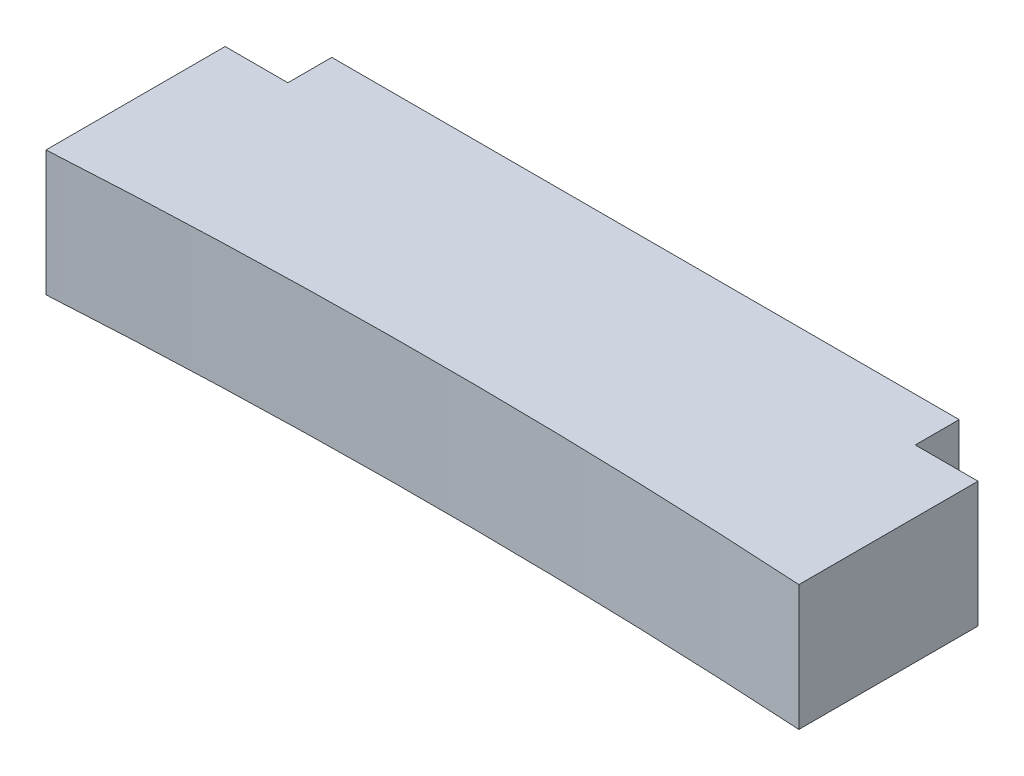
ISO-10303-21;
HEADER;
FILE_DESCRIPTION(('STEP AP214'),'2;1');
FILE_NAME('part.step','',(''),(''),'','','');
FILE_SCHEMA(('AUTOMOTIVE_DESIGN { 1 0 10303 214 1 1 1 1 }'));
ENDSEC;
DATA;
#1=APPLICATION_CONTEXT('core data for automotive mechanical design processes');
#2=APPLICATION_PROTOCOL_DEFINITION('international standard','automotive_design',2000,#1);
#3=PRODUCT_CONTEXT('',#1,'mechanical');
#4=PRODUCT('Part','Part','',(#3));
#5=PRODUCT_RELATED_PRODUCT_CATEGORY('part','',(#4));
#6=PRODUCT_DEFINITION_FORMATION('','',#4);
#7=PRODUCT_DEFINITION_CONTEXT('part definition',#1,'design');
#8=PRODUCT_DEFINITION('design','',#6,#7);
#9=PRODUCT_DEFINITION_SHAPE('','',#8);
#10=(LENGTH_UNIT() NAMED_UNIT(*) SI_UNIT(.MILLI.,.METRE.));
#11=(NAMED_UNIT(*) PLANE_ANGLE_UNIT() SI_UNIT($,.RADIAN.));
#12=(NAMED_UNIT(*) SI_UNIT($,.STERADIAN.) SOLID_ANGLE_UNIT());
#13=UNCERTAINTY_MEASURE_WITH_UNIT(LENGTH_MEASURE(1.E-05),#10,'distance_accuracy_value','');
#14=(GEOMETRIC_REPRESENTATION_CONTEXT(3) GLOBAL_UNCERTAINTY_ASSIGNED_CONTEXT((#13)) GLOBAL_UNIT_ASSIGNED_CONTEXT((#10,
#11,#12)) REPRESENTATION_CONTEXT('',''));
#15=CARTESIAN_POINT('',(0.,0.,0.));
#16=DIRECTION('',(0.,0.,1.));
#17=DIRECTION('',(1.,0.,0.));
#18=AXIS2_PLACEMENT_3D('',#15,#16,#17);
#19=CARTESIAN_POINT('',(-20.,4.,0.));
#20=DIRECTION('',(0.,0.,1.));
#21=DIRECTION('',(1.,0.,0.));
#22=AXIS2_PLACEMENT_3D('',#19,#20,#21);
#23=PLANE('',#22);
#24=DIRECTION('',(-1.,0.,0.));
#25=VECTOR('',#24,1.);
#26=CARTESIAN_POINT('',(-20.,-4.,0.));
#27=LINE('',#26,#25);
#28=CARTESIAN_POINT('',(20.,-4.,0.));
#29=VERTEX_POINT('',#28);
#30=CARTESIAN_POINT('',(-20.,-4.,0.));
#31=VERTEX_POINT('',#30);
#32=EDGE_CURVE('E98',#29,#31,#27,.T.);
#33=ORIENTED_EDGE('',*,*,#32,.T.);
#34=DIRECTION('',(0.,-1.,0.));
#35=VECTOR('',#34,1.);
#36=CARTESIAN_POINT('',(-20.,4.,0.));
#37=LINE('',#36,#35);
#38=CARTESIAN_POINT('',(-20.,4.,0.));
#39=VERTEX_POINT('',#38);
#40=EDGE_CURVE('E11',#39,#31,#37,.T.);
#41=ORIENTED_EDGE('',*,*,#40,.F.);
#42=DIRECTION('',(-1.,0.,0.));
#43=VECTOR('',#42,1.);
#44=CARTESIAN_POINT('',(0.,4.,0.));
#45=LINE('',#44,#43);
#46=CARTESIAN_POINT('',(20.,4.,0.));
#47=VERTEX_POINT('',#46);
#48=EDGE_CURVE('E104',#47,#39,#45,.T.);
#49=ORIENTED_EDGE('',*,*,#48,.F.);
#50=DIRECTION('',(0.,-1.,0.));
#51=VECTOR('',#50,1.);
#52=CARTESIAN_POINT('',(20.,4.,0.));
#53=LINE('',#52,#51);
#54=EDGE_CURVE('E142',#47,#29,#53,.T.);
#55=ORIENTED_EDGE('',*,*,#54,.T.);
#56=EDGE_LOOP('',(#33,#41,#49,#55));
#57=FACE_BOUND('',#56,.T.);
#58=ADVANCED_FACE('F45',(#57),#23,.F.);
#59=CARTESIAN_POINT('',(-20.,4.,0.));
#60=DIRECTION('',(1.,0.,0.));
#61=DIRECTION('',(0.,0.,-1.));
#62=AXIS2_PLACEMENT_3D('',#59,#60,#61);
#63=PLANE('',#62);
#64=DIRECTION('',(0.,0.,1.));
#65=VECTOR('',#64,1.);
#66=CARTESIAN_POINT('',(-20.,-4.,0.));
#67=LINE('',#66,#65);
#68=CARTESIAN_POINT('',(-20.,-4.,2.8));
#69=VERTEX_POINT('',#68);
#70=EDGE_CURVE('E148',#31,#69,#67,.T.);
#71=ORIENTED_EDGE('',*,*,#70,.T.);
#72=DIRECTION('',(0.,-1.,0.));
#73=VECTOR('',#72,1.);
#74=CARTESIAN_POINT('',(-20.,4.,2.8));
#75=LINE('',#74,#73);
#76=CARTESIAN_POINT('',(-20.,4.,2.8));
#77=VERTEX_POINT('',#76);
#78=EDGE_CURVE('E54',#77,#69,#75,.T.);
#79=ORIENTED_EDGE('',*,*,#78,.F.);
#80=DIRECTION('',(0.,0.,1.));
#81=VECTOR('',#80,1.);
#82=CARTESIAN_POINT('',(-20.,4.,0.));
#83=LINE('',#82,#81);
#84=EDGE_CURVE('E208',#39,#77,#83,.T.);
#85=ORIENTED_EDGE('',*,*,#84,.F.);
#86=ORIENTED_EDGE('',*,*,#40,.T.);
#87=EDGE_LOOP('',(#71,#79,#85,#86));
#88=FACE_BOUND('',#87,.T.);
#89=ADVANCED_FACE('F212',(#88),#63,.F.);
#90=CARTESIAN_POINT('',(-20.,4.,2.8));
#91=DIRECTION('',(0.,0.,1.));
#92=DIRECTION('',(1.,0.,0.));
#93=AXIS2_PLACEMENT_3D('',#90,#91,#92);
#94=PLANE('',#93);
#95=DIRECTION('',(-1.,0.,0.));
#96=VECTOR('',#95,1.);
#97=CARTESIAN_POINT('',(-20.,-4.,2.8));
#98=LINE('',#97,#96);
#99=CARTESIAN_POINT('',(-24.,-4.,2.8));
#100=VERTEX_POINT('',#99);
#101=EDGE_CURVE('E151',#69,#100,#98,.T.);
#102=ORIENTED_EDGE('',*,*,#101,.T.);
#103=DIRECTION('',(0.,-1.,0.));
#104=VECTOR('',#103,1.);
#105=CARTESIAN_POINT('',(-24.,4.,2.8));
#106=LINE('',#105,#104);
#107=CARTESIAN_POINT('',(-24.,4.,2.8));
#108=VERTEX_POINT('',#107);
#109=EDGE_CURVE('E178',#108,#100,#106,.T.);
#110=ORIENTED_EDGE('',*,*,#109,.F.);
#111=DIRECTION('',(-1.,0.,0.));
#112=VECTOR('',#111,1.);
#113=CARTESIAN_POINT('',(-20.,4.,2.8));
#114=LINE('',#113,#112);
#115=EDGE_CURVE('E189',#77,#108,#114,.T.);
#116=ORIENTED_EDGE('',*,*,#115,.F.);
#117=ORIENTED_EDGE('',*,*,#78,.T.);
#118=EDGE_LOOP('',(#102,#110,#116,#117));
#119=FACE_BOUND('',#118,.T.);
#120=ADVANCED_FACE('F187',(#119),#94,.F.);
#121=CARTESIAN_POINT('',(-24.,4.,2.8));
#122=DIRECTION('',(1.,0.,0.));
#123=DIRECTION('',(0.,0.,-1.));
#124=AXIS2_PLACEMENT_3D('',#121,#122,#123);
#125=PLANE('',#124);
#126=DIRECTION('',(0.,0.,1.));
#127=VECTOR('',#126,1.);
#128=CARTESIAN_POINT('',(-24.,-4.,2.8));
#129=LINE('',#128,#127);
#130=CARTESIAN_POINT('',(-24.,-4.,14.220649169031));
#131=VERTEX_POINT('',#130);
#132=EDGE_CURVE('E154',#100,#131,#129,.T.);
#133=ORIENTED_EDGE('',*,*,#132,.T.);
#134=DIRECTION('',(0.,-1.,0.));
#135=VECTOR('',#134,1.);
#136=CARTESIAN_POINT('',(-24.,4.,14.220649169031));
#137=LINE('',#136,#135);
#138=CARTESIAN_POINT('',(-24.,4.,14.220649169031));
#139=VERTEX_POINT('',#138);
#140=EDGE_CURVE('E174',#139,#131,#137,.T.);
#141=ORIENTED_EDGE('',*,*,#140,.F.);
#142=DIRECTION('',(0.,0.,1.));
#143=VECTOR('',#142,1.);
#144=CARTESIAN_POINT('',(-24.,4.,2.8));
#145=LINE('',#144,#143);
#146=EDGE_CURVE('E202',#108,#139,#145,.T.);
#147=ORIENTED_EDGE('',*,*,#146,.F.);
#148=ORIENTED_EDGE('',*,*,#109,.T.);
#149=EDGE_LOOP('',(#133,#141,#147,#148));
#150=FACE_BOUND('',#149,.T.);
#151=ADVANCED_FACE('F197',(#150),#125,.F.);
#152=CARTESIAN_POINT('',(0.,4.,413.5));
#153=DIRECTION('',(0.,-1.,0.));
#154=DIRECTION('',(0.,0.,-1.));
#155=AXIS2_PLACEMENT_3D('',#152,#153,#154);
#156=CYLINDRICAL_SURFACE('',#155,400.);
#157=CARTESIAN_POINT('',(0.,-4.,413.5));
#158=DIRECTION('',(0.,-1.,0.));
#159=DIRECTION('',(0.,0.,-1.));
#160=AXIS2_PLACEMENT_3D('',#157,#158,#159);
#161=CIRCLE('',#160,400.);
#162=CARTESIAN_POINT('',(24.,-4.,14.220649169031));
#163=VERTEX_POINT('',#162);
#164=EDGE_CURVE('E157',#131,#163,#161,.T.);
#165=ORIENTED_EDGE('',*,*,#164,.T.);
#166=DIRECTION('',(0.,-1.,0.));
#167=VECTOR('',#166,1.);
#168=CARTESIAN_POINT('',(24.,4.,14.220649169031));
#169=LINE('',#168,#167);
#170=CARTESIAN_POINT('',(24.,4.,14.220649169031));
#171=VERTEX_POINT('',#170);
#172=EDGE_CURVE('E135',#171,#163,#169,.T.);
#173=ORIENTED_EDGE('',*,*,#172,.F.);
#174=CARTESIAN_POINT('',(0.,4.,413.5));
#175=DIRECTION('',(0.,-1.,0.));
#176=DIRECTION('',(0.,0.,-1.));
#177=AXIS2_PLACEMENT_3D('',#174,#175,#176);
#178=CIRCLE('',#177,400.);
#179=EDGE_CURVE('E124',#139,#171,#178,.T.);
#180=ORIENTED_EDGE('',*,*,#179,.F.);
#181=ORIENTED_EDGE('',*,*,#140,.T.);
#182=EDGE_LOOP('',(#165,#173,#180,#181));
#183=FACE_BOUND('',#182,.T.);
#184=ADVANCED_FACE('F200',(#183),#156,.F.);
#185=CARTESIAN_POINT('',(24.,4.,2.8));
#186=DIRECTION('',(-1.,0.,0.));
#187=DIRECTION('',(0.,0.,1.));
#188=AXIS2_PLACEMENT_3D('',#185,#186,#187);
#189=PLANE('',#188);
#190=DIRECTION('',(0.,0.,-1.));
#191=VECTOR('',#190,1.);
#192=CARTESIAN_POINT('',(24.,-4.,2.8));
#193=LINE('',#192,#191);
#194=CARTESIAN_POINT('',(24.,-4.,2.8));
#195=VERTEX_POINT('',#194);
#196=EDGE_CURVE('E133',#163,#195,#193,.T.);
#197=ORIENTED_EDGE('',*,*,#196,.T.);
#198=DIRECTION('',(0.,-1.,0.));
#199=VECTOR('',#198,1.);
#200=CARTESIAN_POINT('',(24.,4.,2.8));
#201=LINE('',#200,#199);
#202=CARTESIAN_POINT('',(24.,4.,2.8));
#203=VERTEX_POINT('',#202);
#204=EDGE_CURVE('E130',#203,#195,#201,.T.);
#205=ORIENTED_EDGE('',*,*,#204,.F.);
#206=DIRECTION('',(0.,0.,-1.));
#207=VECTOR('',#206,1.);
#208=CARTESIAN_POINT('',(24.,4.,2.8));
#209=LINE('',#208,#207);
#210=EDGE_CURVE('E118',#171,#203,#209,.T.);
#211=ORIENTED_EDGE('',*,*,#210,.F.);
#212=ORIENTED_EDGE('',*,*,#172,.T.);
#213=EDGE_LOOP('',(#197,#205,#211,#212));
#214=FACE_BOUND('',#213,.T.);
#215=ADVANCED_FACE('F131',(#214),#189,.F.);
#216=CARTESIAN_POINT('',(20.,4.,2.8));
#217=DIRECTION('',(0.,0.,1.));
#218=DIRECTION('',(1.,0.,0.));
#219=AXIS2_PLACEMENT_3D('',#216,#217,#218);
#220=PLANE('',#219);
#221=DIRECTION('',(-1.,0.,0.));
#222=VECTOR('',#221,1.);
#223=CARTESIAN_POINT('',(20.,-4.,2.8));
#224=LINE('',#223,#222);
#225=CARTESIAN_POINT('',(20.,-4.,2.8));
#226=VERTEX_POINT('',#225);
#227=EDGE_CURVE('E91',#195,#226,#224,.T.);
#228=ORIENTED_EDGE('',*,*,#227,.T.);
#229=DIRECTION('',(0.,-1.,0.));
#230=VECTOR('',#229,1.);
#231=CARTESIAN_POINT('',(20.,4.,2.8));
#232=LINE('',#231,#230);
#233=CARTESIAN_POINT('',(20.,4.,2.8));
#234=VERTEX_POINT('',#233);
#235=EDGE_CURVE('E136',#234,#226,#232,.T.);
#236=ORIENTED_EDGE('',*,*,#235,.F.);
#237=DIRECTION('',(-1.,0.,0.));
#238=VECTOR('',#237,1.);
#239=CARTESIAN_POINT('',(20.,4.,2.8));
#240=LINE('',#239,#238);
#241=EDGE_CURVE('E122',#203,#234,#240,.T.);
#242=ORIENTED_EDGE('',*,*,#241,.F.);
#243=ORIENTED_EDGE('',*,*,#204,.T.);
#244=EDGE_LOOP('',(#228,#236,#242,#243));
#245=FACE_BOUND('',#244,.T.);
#246=ADVANCED_FACE('F138',(#245),#220,.F.);
#247=CARTESIAN_POINT('',(20.,4.,0.));
#248=DIRECTION('',(-1.,0.,0.));
#249=DIRECTION('',(0.,0.,1.));
#250=AXIS2_PLACEMENT_3D('',#247,#248,#249);
#251=PLANE('',#250);
#252=DIRECTION('',(0.,0.,-1.));
#253=VECTOR('',#252,1.);
#254=CARTESIAN_POINT('',(20.,-4.,0.));
#255=LINE('',#254,#253);
#256=EDGE_CURVE('E164',#226,#29,#255,.T.);
#257=ORIENTED_EDGE('',*,*,#256,.T.);
#258=ORIENTED_EDGE('',*,*,#54,.F.);
#259=DIRECTION('',(0.,0.,-1.));
#260=VECTOR('',#259,1.);
#261=CARTESIAN_POINT('',(20.,4.,0.));
#262=LINE('',#261,#260);
#263=EDGE_CURVE('E62',#234,#47,#262,.T.);
#264=ORIENTED_EDGE('',*,*,#263,.F.);
#265=ORIENTED_EDGE('',*,*,#235,.T.);
#266=EDGE_LOOP('',(#257,#258,#264,#265));
#267=FACE_BOUND('',#266,.T.);
#268=ADVANCED_FACE('F215',(#267),#251,.F.);
#269=CARTESIAN_POINT('',(0.,4.,413.5));
#270=DIRECTION('',(0.,-1.,0.));
#271=DIRECTION('',(0.,0.,-1.));
#272=AXIS2_PLACEMENT_3D('',#269,#270,#271);
#273=PLANE('',#272);
#274=ORIENTED_EDGE('',*,*,#48,.T.);
#275=ORIENTED_EDGE('',*,*,#84,.T.);
#276=ORIENTED_EDGE('',*,*,#115,.T.);
#277=ORIENTED_EDGE('',*,*,#146,.T.);
#278=ORIENTED_EDGE('',*,*,#179,.T.);
#279=ORIENTED_EDGE('',*,*,#210,.T.);
#280=ORIENTED_EDGE('',*,*,#241,.T.);
#281=ORIENTED_EDGE('',*,*,#263,.T.);
#282=EDGE_LOOP('',(#274,#275,#276,#277,#278,#279,#280,#281));
#283=FACE_BOUND('',#282,.T.);
#284=ADVANCED_FACE('F120',(#283),#273,.F.);
#285=CARTESIAN_POINT('',(0.,-4.,413.5));
#286=DIRECTION('',(0.,-1.,0.));
#287=DIRECTION('',(0.,0.,-1.));
#288=AXIS2_PLACEMENT_3D('',#285,#286,#287);
#289=PLANE('',#288);
#290=ORIENTED_EDGE('',*,*,#32,.F.);
#291=ORIENTED_EDGE('',*,*,#256,.F.);
#292=ORIENTED_EDGE('',*,*,#227,.F.);
#293=ORIENTED_EDGE('',*,*,#196,.F.);
#294=ORIENTED_EDGE('',*,*,#164,.F.);
#295=ORIENTED_EDGE('',*,*,#132,.F.);
#296=ORIENTED_EDGE('',*,*,#101,.F.);
#297=ORIENTED_EDGE('',*,*,#70,.F.);
#298=EDGE_LOOP('',(#290,#291,#292,#293,#294,#295,#296,#297));
#299=FACE_BOUND('',#298,.T.);
#300=ADVANCED_FACE('F193',(#299),#289,.T.);
#301=CLOSED_SHELL('',(#58,#89,#120,#151,#184,#215,#246,#268,#284,#300));
#302=MANIFOLD_SOLID_BREP('B2',#301);
#303=ADVANCED_BREP_SHAPE_REPRESENTATION('',(#18,#302),#14);
#304=SHAPE_DEFINITION_REPRESENTATION(#9,#303);
ENDSEC;
END-ISO-10303-21;
